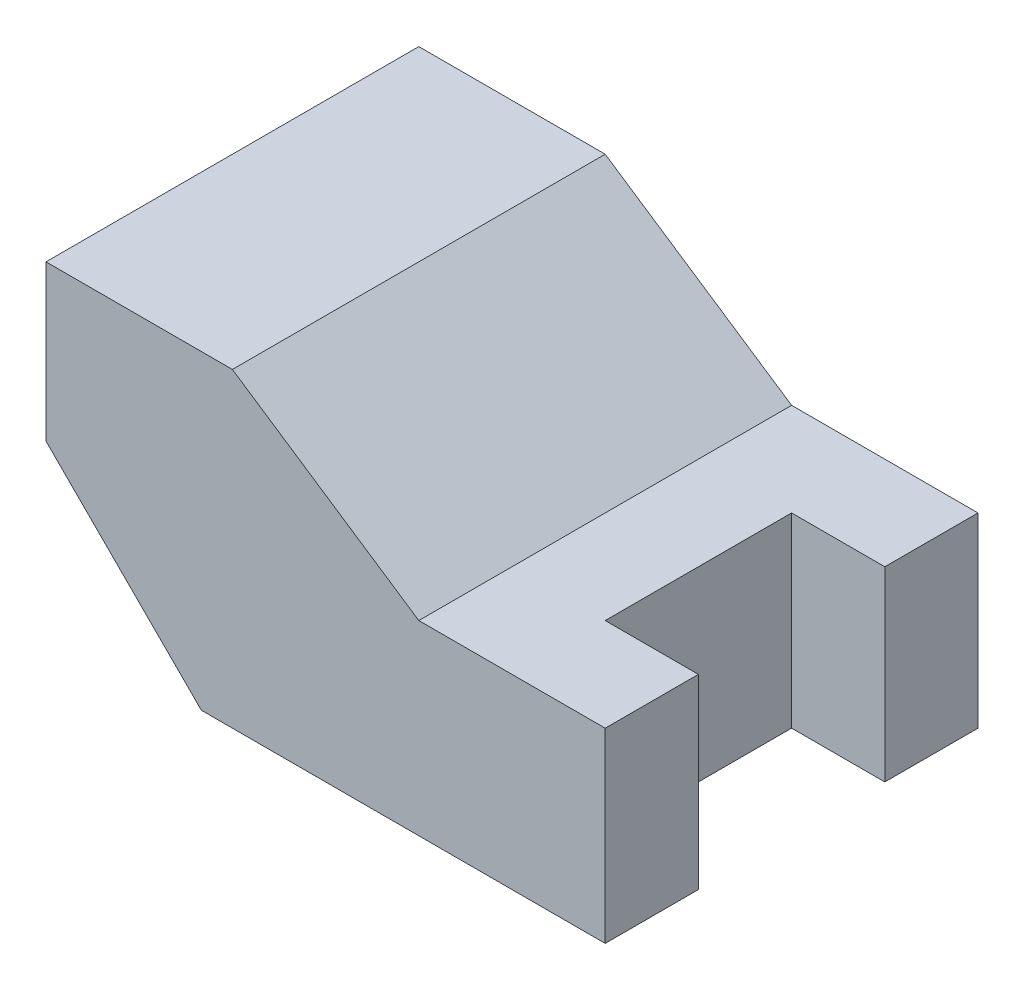
ISO-10303-21;
HEADER;
FILE_DESCRIPTION(('STEP AP214'),'2;1');
FILE_NAME('part.step','',(''),(''),'','','');
FILE_SCHEMA(('AUTOMOTIVE_DESIGN { 1 0 10303 214 1 1 1 1 }'));
ENDSEC;
DATA;
#1=APPLICATION_CONTEXT('core data for automotive mechanical design processes');
#2=APPLICATION_PROTOCOL_DEFINITION('international standard','automotive_design',2000,#1);
#3=PRODUCT_CONTEXT('',#1,'mechanical');
#4=PRODUCT('Part','Part','',(#3));
#5=PRODUCT_RELATED_PRODUCT_CATEGORY('part','',(#4));
#6=PRODUCT_DEFINITION_FORMATION('','',#4);
#7=PRODUCT_DEFINITION_CONTEXT('part definition',#1,'design');
#8=PRODUCT_DEFINITION('design','',#6,#7);
#9=PRODUCT_DEFINITION_SHAPE('','',#8);
#10=(LENGTH_UNIT() NAMED_UNIT(*) SI_UNIT(.MILLI.,.METRE.));
#11=(NAMED_UNIT(*) PLANE_ANGLE_UNIT() SI_UNIT($,.RADIAN.));
#12=(NAMED_UNIT(*) SI_UNIT($,.STERADIAN.) SOLID_ANGLE_UNIT());
#13=UNCERTAINTY_MEASURE_WITH_UNIT(LENGTH_MEASURE(1.E-05),#10,'distance_accuracy_value','');
#14=(GEOMETRIC_REPRESENTATION_CONTEXT(3) GLOBAL_UNCERTAINTY_ASSIGNED_CONTEXT((#13)) GLOBAL_UNIT_ASSIGNED_CONTEXT((#10,
#11,#12)) REPRESENTATION_CONTEXT('',''));
#15=CARTESIAN_POINT('',(0.,0.,0.));
#16=DIRECTION('',(0.,0.,1.));
#17=DIRECTION('',(1.,0.,0.));
#18=AXIS2_PLACEMENT_3D('',#15,#16,#17);
#19=CARTESIAN_POINT('',(1143.,-635.,1524.));
#20=DIRECTION('',(-1.,0.,0.));
#21=DIRECTION('',(0.,0.,1.));
#22=AXIS2_PLACEMENT_3D('',#19,#20,#21);
#23=PLANE('',#22);
#24=DIRECTION('',(0.,0.,-1.));
#25=VECTOR('',#24,1.);
#26=CARTESIAN_POINT('',(1143.,-635.,1524.));
#27=LINE('',#26,#25);
#28=CARTESIAN_POINT('',(1143.,-635.,1524.));
#29=VERTEX_POINT('',#28);
#30=CARTESIAN_POINT('',(1143.,-635.,1143.));
#31=VERTEX_POINT('',#30);
#32=EDGE_CURVE('E48',#29,#31,#27,.T.);
#33=ORIENTED_EDGE('',*,*,#32,.T.);
#34=DIRECTION('',(0.,1.,0.));
#35=VECTOR('',#34,1.);
#36=CARTESIAN_POINT('',(1143.,-1397.,1143.));
#37=LINE('',#36,#35);
#38=CARTESIAN_POINT('',(1143.,127.,1143.));
#39=VERTEX_POINT('',#38);
#40=EDGE_CURVE('E149',#31,#39,#37,.T.);
#41=ORIENTED_EDGE('',*,*,#40,.T.);
#42=DIRECTION('',(0.,0.,1.));
#43=VECTOR('',#42,1.);
#44=CARTESIAN_POINT('',(1143.,127.,0.));
#45=LINE('',#44,#43);
#46=CARTESIAN_POINT('',(1143.,127.,1524.));
#47=VERTEX_POINT('',#46);
#48=EDGE_CURVE('E185',#39,#47,#45,.T.);
#49=ORIENTED_EDGE('',*,*,#48,.T.);
#50=DIRECTION('',(0.,1.,0.));
#51=VECTOR('',#50,1.);
#52=CARTESIAN_POINT('',(1143.,-635.,1524.));
#53=LINE('',#52,#51);
#54=EDGE_CURVE('E205',#29,#47,#53,.T.);
#55=ORIENTED_EDGE('',*,*,#54,.F.);
#56=EDGE_LOOP('',(#33,#41,#49,#55));
#57=FACE_BOUND('',#56,.T.);
#58=ADVANCED_FACE('F39',(#57),#23,.F.);
#59=CARTESIAN_POINT('',(1143.,127.,0.));
#60=VERTEX_POINT('',#59);
#61=CARTESIAN_POINT('',(1143.,127.,381.));
#62=VERTEX_POINT('',#61);
#63=EDGE_CURVE('E181',#60,#62,#45,.T.);
#64=ORIENTED_EDGE('',*,*,#63,.T.);
#65=DIRECTION('',(0.,1.,0.));
#66=VECTOR('',#65,1.);
#67=CARTESIAN_POINT('',(1143.,-1397.,381.));
#68=LINE('',#67,#66);
#69=CARTESIAN_POINT('',(1143.,-635.,381.));
#70=VERTEX_POINT('',#69);
#71=EDGE_CURVE('E55',#70,#62,#68,.T.);
#72=ORIENTED_EDGE('',*,*,#71,.F.);
#73=CARTESIAN_POINT('',(1143.,-635.,0.));
#74=VERTEX_POINT('',#73);
#75=EDGE_CURVE('E220',#70,#74,#27,.T.);
#76=ORIENTED_EDGE('',*,*,#75,.T.);
#77=DIRECTION('',(0.,1.,0.));
#78=VECTOR('',#77,1.);
#79=CARTESIAN_POINT('',(1143.,-635.,0.));
#80=LINE('',#79,#78);
#81=EDGE_CURVE('E202',#74,#60,#80,.T.);
#82=ORIENTED_EDGE('',*,*,#81,.T.);
#83=EDGE_LOOP('',(#64,#72,#76,#82));
#84=FACE_BOUND('',#83,.T.);
#85=ADVANCED_FACE('F41',(#84),#23,.F.);
#86=CARTESIAN_POINT('',(-1143.,635.,1524.));
#87=DIRECTION('',(0.,-1.,0.));
#88=DIRECTION('',(0.,0.,-1.));
#89=AXIS2_PLACEMENT_3D('',#86,#87,#88);
#90=PLANE('',#89);
#91=DIRECTION('',(-1.,0.,0.));
#92=VECTOR('',#91,1.);
#93=CARTESIAN_POINT('',(-1143.,635.,1524.));
#94=LINE('',#93,#92);
#95=CARTESIAN_POINT('',(-381.,635.,1524.));
#96=VERTEX_POINT('',#95);
#97=CARTESIAN_POINT('',(-1143.,635.,1524.));
#98=VERTEX_POINT('',#97);
#99=EDGE_CURVE('E209',#96,#98,#94,.T.);
#100=ORIENTED_EDGE('',*,*,#99,.F.);
#101=DIRECTION('',(0.,0.,1.));
#102=VECTOR('',#101,1.);
#103=CARTESIAN_POINT('',(-381.,635.,0.));
#104=LINE('',#103,#102);
#105=CARTESIAN_POINT('',(-381.,635.,0.));
#106=VERTEX_POINT('',#105);
#107=EDGE_CURVE('E174',#106,#96,#104,.T.);
#108=ORIENTED_EDGE('',*,*,#107,.F.);
#109=DIRECTION('',(-1.,0.,0.));
#110=VECTOR('',#109,1.);
#111=CARTESIAN_POINT('',(-1143.,635.,0.));
#112=LINE('',#111,#110);
#113=CARTESIAN_POINT('',(-1143.,635.,0.));
#114=VERTEX_POINT('',#113);
#115=EDGE_CURVE('E224',#106,#114,#112,.T.);
#116=ORIENTED_EDGE('',*,*,#115,.T.);
#117=DIRECTION('',(0.,0.,-1.));
#118=VECTOR('',#117,1.);
#119=CARTESIAN_POINT('',(-1143.,635.,1524.));
#120=LINE('',#119,#118);
#121=EDGE_CURVE('E11',#98,#114,#120,.T.);
#122=ORIENTED_EDGE('',*,*,#121,.F.);
#123=EDGE_LOOP('',(#100,#108,#116,#122));
#124=FACE_BOUND('',#123,.T.);
#125=ADVANCED_FACE('F257',(#124),#90,.F.);
#126=CARTESIAN_POINT('',(-1143.,-635.,1524.));
#127=DIRECTION('',(1.,0.,0.));
#128=DIRECTION('',(0.,0.,-1.));
#129=AXIS2_PLACEMENT_3D('',#126,#127,#128);
#130=PLANE('',#129);
#131=DIRECTION('',(0.,-1.,0.));
#132=VECTOR('',#131,1.);
#133=CARTESIAN_POINT('',(-1143.,-635.,0.));
#134=LINE('',#133,#132);
#135=CARTESIAN_POINT('',(-1143.,0.,0.));
#136=VERTEX_POINT('',#135);
#137=EDGE_CURVE('E227',#114,#136,#134,.T.);
#138=ORIENTED_EDGE('',*,*,#137,.T.);
#139=DIRECTION('',(0.,0.,1.));
#140=VECTOR('',#139,1.);
#141=CARTESIAN_POINT('',(-1143.,-1.11022302462516E-13,0.));
#142=LINE('',#141,#140);
#143=CARTESIAN_POINT('',(-1143.,-1.11022302462516E-13,1524.));
#144=VERTEX_POINT('',#143);
#145=EDGE_CURVE('E198',#136,#144,#142,.T.);
#146=ORIENTED_EDGE('',*,*,#145,.T.);
#147=DIRECTION('',(0.,-1.,0.));
#148=VECTOR('',#147,1.);
#149=CARTESIAN_POINT('',(-1143.,-635.,1524.));
#150=LINE('',#149,#148);
#151=EDGE_CURVE('E213',#98,#144,#150,.T.);
#152=ORIENTED_EDGE('',*,*,#151,.F.);
#153=ORIENTED_EDGE('',*,*,#121,.T.);
#154=EDGE_LOOP('',(#138,#146,#152,#153));
#155=FACE_BOUND('',#154,.T.);
#156=ADVANCED_FACE('F270',(#155),#130,.F.);
#157=CARTESIAN_POINT('',(-1143.,-635.,1524.));
#158=DIRECTION('',(0.,1.,0.));
#159=DIRECTION('',(0.,0.,1.));
#160=AXIS2_PLACEMENT_3D('',#157,#158,#159);
#161=PLANE('',#160);
#162=DIRECTION('',(0.,0.,1.));
#163=VECTOR('',#162,1.);
#164=CARTESIAN_POINT('',(762.,-635.,1524.));
#165=LINE('',#164,#163);
#166=CARTESIAN_POINT('',(762.,-635.,381.));
#167=VERTEX_POINT('',#166);
#168=CARTESIAN_POINT('',(762.,-635.,1143.));
#169=VERTEX_POINT('',#168);
#170=EDGE_CURVE('E131',#167,#169,#165,.T.);
#171=ORIENTED_EDGE('',*,*,#170,.T.);
#172=DIRECTION('',(1.,0.,0.));
#173=VECTOR('',#172,1.);
#174=CARTESIAN_POINT('',(-1143.,-635.,1143.));
#175=LINE('',#174,#173);
#176=EDGE_CURVE('E162',#169,#31,#175,.T.);
#177=ORIENTED_EDGE('',*,*,#176,.T.);
#178=ORIENTED_EDGE('',*,*,#32,.F.);
#179=DIRECTION('',(1.,0.,0.));
#180=VECTOR('',#179,1.);
#181=CARTESIAN_POINT('',(-1143.,-635.,1524.));
#182=LINE('',#181,#180);
#183=CARTESIAN_POINT('',(-508.,-635.,1524.));
#184=VERTEX_POINT('',#183);
#185=EDGE_CURVE('E217',#184,#29,#182,.T.);
#186=ORIENTED_EDGE('',*,*,#185,.F.);
#187=DIRECTION('',(0.,0.,1.));
#188=VECTOR('',#187,1.);
#189=CARTESIAN_POINT('',(-508.,-635.,0.));
#190=LINE('',#189,#188);
#191=CARTESIAN_POINT('',(-508.,-635.,0.));
#192=VERTEX_POINT('',#191);
#193=EDGE_CURVE('E195',#192,#184,#190,.T.);
#194=ORIENTED_EDGE('',*,*,#193,.F.);
#195=DIRECTION('',(1.,0.,0.));
#196=VECTOR('',#195,1.);
#197=CARTESIAN_POINT('',(-1143.,-635.,0.));
#198=LINE('',#197,#196);
#199=EDGE_CURVE('E210',#192,#74,#198,.T.);
#200=ORIENTED_EDGE('',*,*,#199,.T.);
#201=ORIENTED_EDGE('',*,*,#75,.F.);
#202=DIRECTION('',(-1.,0.,0.));
#203=VECTOR('',#202,1.);
#204=CARTESIAN_POINT('',(-1143.,-635.,381.000000000001));
#205=LINE('',#204,#203);
#206=EDGE_CURVE('E153',#70,#167,#205,.T.);
#207=ORIENTED_EDGE('',*,*,#206,.T.);
#208=EDGE_LOOP('',(#171,#177,#178,#186,#194,#200,#201,#207));
#209=FACE_BOUND('',#208,.T.);
#210=ADVANCED_FACE('F245',(#209),#161,.F.);
#211=CARTESIAN_POINT('',(0.,0.,1524.));
#212=DIRECTION('',(0.,0.,-1.));
#213=DIRECTION('',(-1.,0.,0.));
#214=AXIS2_PLACEMENT_3D('',#211,#212,#213);
#215=PLANE('',#214);
#216=ORIENTED_EDGE('',*,*,#54,.T.);
#217=DIRECTION('',(1.,0.,0.));
#218=VECTOR('',#217,1.);
#219=CARTESIAN_POINT('',(1143.,127.,1524.));
#220=LINE('',#219,#218);
#221=CARTESIAN_POINT('',(381.,127.,1524.));
#222=VERTEX_POINT('',#221);
#223=EDGE_CURVE('E171',#222,#47,#220,.T.);
#224=ORIENTED_EDGE('',*,*,#223,.F.);
#225=DIRECTION('',(0.832050294337844,-0.554700196225229,0.));
#226=VECTOR('',#225,1.);
#227=CARTESIAN_POINT('',(381.,127.,1524.));
#228=LINE('',#227,#226);
#229=EDGE_CURVE('E166',#96,#222,#228,.T.);
#230=ORIENTED_EDGE('',*,*,#229,.F.);
#231=ORIENTED_EDGE('',*,*,#99,.T.);
#232=ORIENTED_EDGE('',*,*,#151,.T.);
#233=DIRECTION('',(-0.707106781186547,0.707106781186547,0.));
#234=VECTOR('',#233,1.);
#235=CARTESIAN_POINT('',(-1143.,-1.11022302462516E-13,1524.));
#236=LINE('',#235,#234);
#237=EDGE_CURVE('E184',#184,#144,#236,.T.);
#238=ORIENTED_EDGE('',*,*,#237,.F.);
#239=ORIENTED_EDGE('',*,*,#185,.T.);
#240=EDGE_LOOP('',(#216,#224,#230,#231,#232,#238,#239));
#241=FACE_BOUND('',#240,.T.);
#242=ADVANCED_FACE('F261',(#241),#215,.F.);
#243=CARTESIAN_POINT('',(0.,0.,0.));
#244=DIRECTION('',(0.,0.,-1.));
#245=DIRECTION('',(-1.,0.,0.));
#246=AXIS2_PLACEMENT_3D('',#243,#244,#245);
#247=PLANE('',#246);
#248=DIRECTION('',(1.,0.,0.));
#249=VECTOR('',#248,1.);
#250=CARTESIAN_POINT('',(1143.,127.,0.));
#251=LINE('',#250,#249);
#252=CARTESIAN_POINT('',(381.,127.,0.));
#253=VERTEX_POINT('',#252);
#254=EDGE_CURVE('E63',#253,#60,#251,.T.);
#255=ORIENTED_EDGE('',*,*,#254,.T.);
#256=ORIENTED_EDGE('',*,*,#81,.F.);
#257=ORIENTED_EDGE('',*,*,#199,.F.);
#258=DIRECTION('',(-0.707106781186547,0.707106781186547,0.));
#259=VECTOR('',#258,1.);
#260=CARTESIAN_POINT('',(-1143.,-1.11022302462516E-13,0.));
#261=LINE('',#260,#259);
#262=EDGE_CURVE('E191',#192,#136,#261,.T.);
#263=ORIENTED_EDGE('',*,*,#262,.T.);
#264=ORIENTED_EDGE('',*,*,#137,.F.);
#265=ORIENTED_EDGE('',*,*,#115,.F.);
#266=DIRECTION('',(0.832050294337844,-0.554700196225229,0.));
#267=VECTOR('',#266,1.);
#268=CARTESIAN_POINT('',(381.,127.,0.));
#269=LINE('',#268,#267);
#270=EDGE_CURVE('E167',#106,#253,#269,.T.);
#271=ORIENTED_EDGE('',*,*,#270,.T.);
#272=EDGE_LOOP('',(#255,#256,#257,#263,#264,#265,#271));
#273=FACE_BOUND('',#272,.T.);
#274=ADVANCED_FACE('F248',(#273),#247,.T.);
#275=CARTESIAN_POINT('',(-1143.,-1.11022302462516E-13,0.));
#276=DIRECTION('',(0.707106781186548,0.707106781186548,0.));
#277=DIRECTION('',(-0.707106781186548,0.707106781186548,0.));
#278=AXIS2_PLACEMENT_3D('',#275,#276,#277);
#279=PLANE('',#278);
#280=ORIENTED_EDGE('',*,*,#237,.T.);
#281=ORIENTED_EDGE('',*,*,#145,.F.);
#282=ORIENTED_EDGE('',*,*,#262,.F.);
#283=ORIENTED_EDGE('',*,*,#193,.T.);
#284=EDGE_LOOP('',(#280,#281,#282,#283));
#285=FACE_BOUND('',#284,.T.);
#286=ADVANCED_FACE('F268',(#285),#279,.F.);
#287=CARTESIAN_POINT('',(1143.,127.,0.));
#288=DIRECTION('',(0.,-1.,0.));
#289=DIRECTION('',(1.,0.,0.));
#290=AXIS2_PLACEMENT_3D('',#287,#288,#289);
#291=PLANE('',#290);
#292=ORIENTED_EDGE('',*,*,#48,.F.);
#293=DIRECTION('',(1.,0.,0.));
#294=VECTOR('',#293,1.);
#295=CARTESIAN_POINT('',(1143.,127.,1143.));
#296=LINE('',#295,#294);
#297=CARTESIAN_POINT('',(762.,127.,1143.));
#298=VERTEX_POINT('',#297);
#299=EDGE_CURVE('E143',#298,#39,#296,.T.);
#300=ORIENTED_EDGE('',*,*,#299,.F.);
#301=DIRECTION('',(0.,0.,1.));
#302=VECTOR('',#301,1.);
#303=CARTESIAN_POINT('',(762.,127.,1143.));
#304=LINE('',#303,#302);
#305=CARTESIAN_POINT('',(762.,127.,381.));
#306=VERTEX_POINT('',#305);
#307=EDGE_CURVE('E128',#306,#298,#304,.T.);
#308=ORIENTED_EDGE('',*,*,#307,.F.);
#309=DIRECTION('',(-1.,0.,0.));
#310=VECTOR('',#309,1.);
#311=CARTESIAN_POINT('',(1143.,127.,381.));
#312=LINE('',#311,#310);
#313=EDGE_CURVE('E136',#62,#306,#312,.T.);
#314=ORIENTED_EDGE('',*,*,#313,.F.);
#315=ORIENTED_EDGE('',*,*,#63,.F.);
#316=ORIENTED_EDGE('',*,*,#254,.F.);
#317=DIRECTION('',(0.,0.,1.));
#318=VECTOR('',#317,1.);
#319=CARTESIAN_POINT('',(381.,127.,0.));
#320=LINE('',#319,#318);
#321=EDGE_CURVE('E186',#253,#222,#320,.T.);
#322=ORIENTED_EDGE('',*,*,#321,.T.);
#323=ORIENTED_EDGE('',*,*,#223,.T.);
#324=EDGE_LOOP('',(#292,#300,#308,#314,#315,#316,#322,#323));
#325=FACE_BOUND('',#324,.T.);
#326=ADVANCED_FACE('F142',(#325),#291,.F.);
#327=CARTESIAN_POINT('',(381.,127.,0.));
#328=DIRECTION('',(-0.554700196225229,-0.832050294337844,0.));
#329=DIRECTION('',(0.832050294337844,-0.554700196225229,0.));
#330=AXIS2_PLACEMENT_3D('',#327,#328,#329);
#331=PLANE('',#330);
#332=ORIENTED_EDGE('',*,*,#229,.T.);
#333=ORIENTED_EDGE('',*,*,#321,.F.);
#334=ORIENTED_EDGE('',*,*,#270,.F.);
#335=ORIENTED_EDGE('',*,*,#107,.T.);
#336=EDGE_LOOP('',(#332,#333,#334,#335));
#337=FACE_BOUND('',#336,.T.);
#338=ADVANCED_FACE('F253',(#337),#331,.F.);
#339=CARTESIAN_POINT('',(1143.,-1397.,1143.));
#340=DIRECTION('',(0.,0.,1.));
#341=DIRECTION('',(1.,0.,0.));
#342=AXIS2_PLACEMENT_3D('',#339,#340,#341);
#343=PLANE('',#342);
#344=DIRECTION('',(0.,1.,0.));
#345=VECTOR('',#344,1.);
#346=CARTESIAN_POINT('',(762.,-1397.,1143.));
#347=LINE('',#346,#345);
#348=EDGE_CURVE('E134',#169,#298,#347,.T.);
#349=ORIENTED_EDGE('',*,*,#348,.T.);
#350=ORIENTED_EDGE('',*,*,#299,.T.);
#351=ORIENTED_EDGE('',*,*,#40,.F.);
#352=ORIENTED_EDGE('',*,*,#176,.F.);
#353=EDGE_LOOP('',(#349,#350,#351,#352));
#354=FACE_BOUND('',#353,.T.);
#355=ADVANCED_FACE('F266',(#354),#343,.F.);
#356=CARTESIAN_POINT('',(762.,-1397.,1143.));
#357=DIRECTION('',(-1.,0.,0.));
#358=DIRECTION('',(0.,-1.,0.));
#359=AXIS2_PLACEMENT_3D('',#356,#357,#358);
#360=PLANE('',#359);
#361=DIRECTION('',(0.,1.,0.));
#362=VECTOR('',#361,1.);
#363=CARTESIAN_POINT('',(762.,-1397.,381.));
#364=LINE('',#363,#362);
#365=EDGE_CURVE('E124',#167,#306,#364,.T.);
#366=ORIENTED_EDGE('',*,*,#365,.T.);
#367=ORIENTED_EDGE('',*,*,#307,.T.);
#368=ORIENTED_EDGE('',*,*,#348,.F.);
#369=ORIENTED_EDGE('',*,*,#170,.F.);
#370=EDGE_LOOP('',(#366,#367,#368,#369));
#371=FACE_BOUND('',#370,.T.);
#372=ADVANCED_FACE('F125',(#371),#360,.F.);
#373=CARTESIAN_POINT('',(1143.,-1397.,381.));
#374=DIRECTION('',(0.,0.,-1.));
#375=DIRECTION('',(-1.,0.,0.));
#376=AXIS2_PLACEMENT_3D('',#373,#374,#375);
#377=PLANE('',#376);
#378=ORIENTED_EDGE('',*,*,#71,.T.);
#379=ORIENTED_EDGE('',*,*,#313,.T.);
#380=ORIENTED_EDGE('',*,*,#365,.F.);
#381=ORIENTED_EDGE('',*,*,#206,.F.);
#382=EDGE_LOOP('',(#378,#379,#380,#381));
#383=FACE_BOUND('',#382,.T.);
#384=ADVANCED_FACE('F137',(#383),#377,.F.);
#385=CLOSED_SHELL('',(#58,#85,#125,#156,#210,#242,#274,#286,#326,#338,#355,#372,#384));
#386=MANIFOLD_SOLID_BREP('B2',#385);
#387=ADVANCED_BREP_SHAPE_REPRESENTATION('',(#18,#386),#14);
#388=SHAPE_DEFINITION_REPRESENTATION(#9,#387);
ENDSEC;
END-ISO-10303-21;
